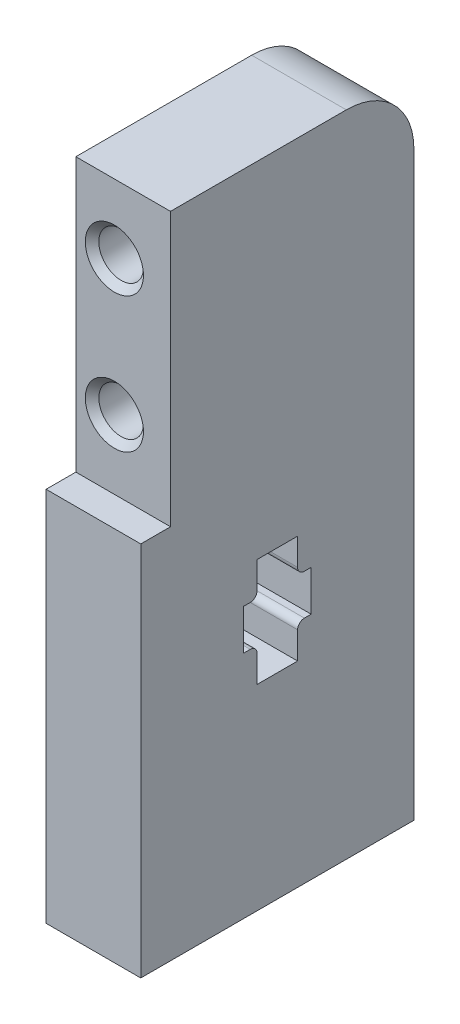
ISO-10303-21;
HEADER;
FILE_DESCRIPTION(('STEP AP214'),'2;1');
FILE_NAME('part.step','',(''),(''),'','','');
FILE_SCHEMA(('AUTOMOTIVE_DESIGN { 1 0 10303 214 1 1 1 1 }'));
ENDSEC;
DATA;
#1=APPLICATION_CONTEXT('core data for automotive mechanical design processes');
#2=APPLICATION_PROTOCOL_DEFINITION('international standard','automotive_design',2000,#1);
#3=PRODUCT_CONTEXT('',#1,'mechanical');
#4=PRODUCT('Part','Part','',(#3));
#5=PRODUCT_RELATED_PRODUCT_CATEGORY('part','',(#4));
#6=PRODUCT_DEFINITION_FORMATION('','',#4);
#7=PRODUCT_DEFINITION_CONTEXT('part definition',#1,'design');
#8=PRODUCT_DEFINITION('design','',#6,#7);
#9=PRODUCT_DEFINITION_SHAPE('','',#8);
#10=(LENGTH_UNIT() NAMED_UNIT(*) SI_UNIT(.MILLI.,.METRE.));
#11=(NAMED_UNIT(*) PLANE_ANGLE_UNIT() SI_UNIT($,.RADIAN.));
#12=(NAMED_UNIT(*) SI_UNIT($,.STERADIAN.) SOLID_ANGLE_UNIT());
#13=UNCERTAINTY_MEASURE_WITH_UNIT(LENGTH_MEASURE(1.E-05),#10,'distance_accuracy_value','');
#14=(GEOMETRIC_REPRESENTATION_CONTEXT(3) GLOBAL_UNCERTAINTY_ASSIGNED_CONTEXT((#13)) GLOBAL_UNIT_ASSIGNED_CONTEXT((#10,
#11,#12)) REPRESENTATION_CONTEXT('',''));
#15=CARTESIAN_POINT('',(0.,0.,0.));
#16=DIRECTION('',(0.,0.,1.));
#17=DIRECTION('',(1.,0.,0.));
#18=AXIS2_PLACEMENT_3D('',#15,#16,#17);
#19=CARTESIAN_POINT('',(0.,17.,-12.6));
#20=DIRECTION('',(0.,-1.,0.));
#21=DIRECTION('',(0.,0.,-1.));
#22=AXIS2_PLACEMENT_3D('',#19,#20,#21);
#23=PLANE('',#22);
#24=DIRECTION('',(0.,0.,-1.));
#25=VECTOR('',#24,1.);
#26=CARTESIAN_POINT('',(7.,17.,-12.6));
#27=LINE('',#26,#25);
#28=CARTESIAN_POINT('',(7.,17.,-7.6));
#29=VERTEX_POINT('',#28);
#30=CARTESIAN_POINT('',(7.,17.,-8.1));
#31=VERTEX_POINT('',#30);
#32=EDGE_CURVE('E250',#29,#31,#27,.T.);
#33=ORIENTED_EDGE('',*,*,#32,.T.);
#34=DIRECTION('',(1.,0.,0.));
#35=VECTOR('',#34,1.);
#36=CARTESIAN_POINT('',(0.,17.,-8.1));
#37=LINE('',#36,#35);
#38=CARTESIAN_POINT('',(0.,17.,-8.1));
#39=VERTEX_POINT('',#38);
#40=EDGE_CURVE('E48',#31,#39,#37,.F.);
#41=ORIENTED_EDGE('',*,*,#40,.T.);
#42=DIRECTION('',(0.,0.,-1.));
#43=VECTOR('',#42,1.);
#44=CARTESIAN_POINT('',(0.,17.,-12.6));
#45=LINE('',#44,#43);
#46=CARTESIAN_POINT('',(0.,17.,-7.6));
#47=VERTEX_POINT('',#46);
#48=EDGE_CURVE('E257',#47,#39,#45,.T.);
#49=ORIENTED_EDGE('',*,*,#48,.F.);
#50=DIRECTION('',(1.,0.,0.));
#51=VECTOR('',#50,1.);
#52=CARTESIAN_POINT('',(0.,17.,-7.6));
#53=LINE('',#52,#51);
#54=EDGE_CURVE('E274',#47,#29,#53,.T.);
#55=ORIENTED_EDGE('',*,*,#54,.T.);
#56=EDGE_LOOP('',(#33,#41,#49,#55));
#57=FACE_BOUND('',#56,.T.);
#58=ADVANCED_FACE('F33',(#57),#23,.F.);
#59=CARTESIAN_POINT('',(0.,20.,-7.6));
#60=DIRECTION('',(0.,1.,0.));
#61=DIRECTION('',(0.,0.,1.));
#62=AXIS2_PLACEMENT_3D('',#59,#60,#61);
#63=PLANE('',#62);
#64=DIRECTION('',(0.,0.,1.));
#65=VECTOR('',#64,1.);
#66=CARTESIAN_POINT('',(0.,20.,-7.6));
#67=LINE('',#66,#65);
#68=CARTESIAN_POINT('',(0.,20.,-8.1));
#69=VERTEX_POINT('',#68);
#70=CARTESIAN_POINT('',(0.,20.,-7.6));
#71=VERTEX_POINT('',#70);
#72=EDGE_CURVE('E249',#69,#71,#67,.T.);
#73=ORIENTED_EDGE('',*,*,#72,.F.);
#74=DIRECTION('',(1.,0.,0.));
#75=VECTOR('',#74,1.);
#76=CARTESIAN_POINT('',(0.,20.,-8.1));
#77=LINE('',#76,#75);
#78=CARTESIAN_POINT('',(7.,20.,-8.1));
#79=VERTEX_POINT('',#78);
#80=EDGE_CURVE('E368',#69,#79,#77,.T.);
#81=ORIENTED_EDGE('',*,*,#80,.T.);
#82=DIRECTION('',(0.,0.,1.));
#83=VECTOR('',#82,1.);
#84=CARTESIAN_POINT('',(7.,20.,-7.6));
#85=LINE('',#84,#83);
#86=CARTESIAN_POINT('',(7.,20.,-7.6));
#87=VERTEX_POINT('',#86);
#88=EDGE_CURVE('E261',#79,#87,#85,.T.);
#89=ORIENTED_EDGE('',*,*,#88,.T.);
#90=DIRECTION('',(1.,0.,0.));
#91=VECTOR('',#90,1.);
#92=CARTESIAN_POINT('',(0.,20.,-7.6));
#93=LINE('',#92,#91);
#94=EDGE_CURVE('E276',#71,#87,#93,.T.);
#95=ORIENTED_EDGE('',*,*,#94,.F.);
#96=EDGE_LOOP('',(#73,#81,#89,#95));
#97=FACE_BOUND('',#96,.T.);
#98=ADVANCED_FACE('F421',(#97),#63,.F.);
#99=CARTESIAN_POINT('',(7.,0.,0.));
#100=DIRECTION('',(0.,1.,0.));
#101=DIRECTION('',(0.,0.,1.));
#102=AXIS2_PLACEMENT_3D('',#99,#100,#101);
#103=PLANE('',#102);
#104=CARTESIAN_POINT('',(2.85000000000001,0.,-15.1));
#105=DIRECTION('',(0.,1.,0.));
#106=DIRECTION('',(0.,0.,1.));
#107=AXIS2_PLACEMENT_3D('',#104,#105,#106);
#108=CIRCLE('',#107,2.14999999999998);
#109=CARTESIAN_POINT('',(2.85000000000001,0.,-12.95));
#110=VERTEX_POINT('',#109);
#111=EDGE_CURVE('E338',#110,#110,#108,.T.);
#112=ORIENTED_EDGE('',*,*,#111,.T.);
#113=EDGE_LOOP('',(#112));
#114=FACE_BOUND('',#113,.T.);
#115=CARTESIAN_POINT('',(2.85,0.,-5.1));
#116=DIRECTION('',(0.,1.,0.));
#117=DIRECTION('',(0.,0.,1.));
#118=AXIS2_PLACEMENT_3D('',#115,#116,#117);
#119=CIRCLE('',#118,2.12);
#120=CARTESIAN_POINT('',(2.85,0.,-2.97999999999999));
#121=VERTEX_POINT('',#120);
#122=EDGE_CURVE('E335',#121,#121,#119,.T.);
#123=ORIENTED_EDGE('',*,*,#122,.T.);
#124=EDGE_LOOP('',(#123));
#125=FACE_BOUND('',#124,.T.);
#126=DIRECTION('',(0.,0.,-1.));
#127=VECTOR('',#126,1.);
#128=CARTESIAN_POINT('',(0.,0.,0.));
#129=LINE('',#128,#127);
#130=CARTESIAN_POINT('',(0.,0.,0.));
#131=VERTEX_POINT('',#130);
#132=CARTESIAN_POINT('',(0.,0.,-20.2));
#133=VERTEX_POINT('',#132);
#134=EDGE_CURVE('E324',#131,#133,#129,.T.);
#135=ORIENTED_EDGE('',*,*,#134,.T.);
#136=DIRECTION('',(-1.,0.,0.));
#137=VECTOR('',#136,1.);
#138=CARTESIAN_POINT('',(7.,0.,-20.2));
#139=LINE('',#138,#137);
#140=CARTESIAN_POINT('',(7.,0.,-20.2));
#141=VERTEX_POINT('',#140);
#142=EDGE_CURVE('E322',#141,#133,#139,.T.);
#143=ORIENTED_EDGE('',*,*,#142,.F.);
#144=DIRECTION('',(0.,0.,-1.));
#145=VECTOR('',#144,1.);
#146=CARTESIAN_POINT('',(7.,0.,0.));
#147=LINE('',#146,#145);
#148=CARTESIAN_POINT('',(7.,0.,0.));
#149=VERTEX_POINT('',#148);
#150=EDGE_CURVE('E314',#149,#141,#147,.T.);
#151=ORIENTED_EDGE('',*,*,#150,.F.);
#152=DIRECTION('',(-1.,0.,0.));
#153=VECTOR('',#152,1.);
#154=CARTESIAN_POINT('',(7.,0.,0.));
#155=LINE('',#154,#153);
#156=EDGE_CURVE('E332',#149,#131,#155,.T.);
#157=ORIENTED_EDGE('',*,*,#156,.T.);
#158=EDGE_LOOP('',(#135,#143,#151,#157));
#159=FACE_BOUND('',#158,.T.);
#160=ADVANCED_FACE('F462',(#114,#125,#159),#103,.F.);
#161=CARTESIAN_POINT('',(7.,48.,0.));
#162=DIRECTION('',(0.,-1.,0.));
#163=DIRECTION('',(0.,0.,-1.));
#164=AXIS2_PLACEMENT_3D('',#161,#162,#163);
#165=PLANE('',#164);
#166=DIRECTION('',(0.,0.,1.));
#167=VECTOR('',#166,1.);
#168=CARTESIAN_POINT('',(7.,48.,0.));
#169=LINE('',#168,#167);
#170=CARTESIAN_POINT('',(7.,48.,-15.2));
#171=VERTEX_POINT('',#170);
#172=CARTESIAN_POINT('',(7.,48.,-2.2));
#173=VERTEX_POINT('',#172);
#174=EDGE_CURVE('E320',#171,#173,#169,.T.);
#175=ORIENTED_EDGE('',*,*,#174,.F.);
#176=DIRECTION('',(-1.,0.,0.));
#177=VECTOR('',#176,1.);
#178=CARTESIAN_POINT('',(7.,48.,-15.2));
#179=LINE('',#178,#177);
#180=CARTESIAN_POINT('',(0.,48.,-15.2));
#181=VERTEX_POINT('',#180);
#182=EDGE_CURVE('E359',#171,#181,#179,.T.);
#183=ORIENTED_EDGE('',*,*,#182,.T.);
#184=DIRECTION('',(0.,0.,1.));
#185=VECTOR('',#184,1.);
#186=CARTESIAN_POINT('',(0.,48.,0.));
#187=LINE('',#186,#185);
#188=CARTESIAN_POINT('',(0.,48.,-2.2));
#189=VERTEX_POINT('',#188);
#190=EDGE_CURVE('E315',#181,#189,#187,.T.);
#191=ORIENTED_EDGE('',*,*,#190,.T.);
#192=DIRECTION('',(-1.,0.,0.));
#193=VECTOR('',#192,1.);
#194=CARTESIAN_POINT('',(0.,48.,-2.2));
#195=LINE('',#194,#193);
#196=EDGE_CURVE('E302',#173,#189,#195,.T.);
#197=ORIENTED_EDGE('',*,*,#196,.F.);
#198=EDGE_LOOP('',(#175,#183,#191,#197));
#199=FACE_BOUND('',#198,.T.);
#200=ADVANCED_FACE('F525',(#199),#165,.F.);
#201=CARTESIAN_POINT('',(7.,0.,0.));
#202=DIRECTION('',(0.,0.,-1.));
#203=DIRECTION('',(-1.,0.,0.));
#204=AXIS2_PLACEMENT_3D('',#201,#202,#203);
#205=PLANE('',#204);
#206=DIRECTION('',(0.,-1.,0.));
#207=VECTOR('',#206,1.);
#208=CARTESIAN_POINT('',(7.,0.,0.));
#209=LINE('',#208,#207);
#210=CARTESIAN_POINT('',(7.,27.8,0.));
#211=VERTEX_POINT('',#210);
#212=EDGE_CURVE('E312',#211,#149,#209,.T.);
#213=ORIENTED_EDGE('',*,*,#212,.F.);
#214=DIRECTION('',(1.,0.,0.));
#215=VECTOR('',#214,1.);
#216=CARTESIAN_POINT('',(0.,27.8,0.));
#217=LINE('',#216,#215);
#218=CARTESIAN_POINT('',(0.,27.8,0.));
#219=VERTEX_POINT('',#218);
#220=EDGE_CURVE('E292',#219,#211,#217,.T.);
#221=ORIENTED_EDGE('',*,*,#220,.F.);
#222=DIRECTION('',(0.,-1.,0.));
#223=VECTOR('',#222,1.);
#224=CARTESIAN_POINT('',(0.,0.,0.));
#225=LINE('',#224,#223);
#226=EDGE_CURVE('E310',#219,#131,#225,.T.);
#227=ORIENTED_EDGE('',*,*,#226,.T.);
#228=ORIENTED_EDGE('',*,*,#156,.F.);
#229=EDGE_LOOP('',(#213,#221,#227,#228));
#230=FACE_BOUND('',#229,.T.);
#231=ADVANCED_FACE('F528',(#230),#205,.F.);
#232=CARTESIAN_POINT('',(7.,0.,-20.2));
#233=DIRECTION('',(0.,0.,1.));
#234=DIRECTION('',(1.,0.,0.));
#235=AXIS2_PLACEMENT_3D('',#232,#233,#234);
#236=PLANE('',#235);
#237=DIRECTION('',(0.,1.,0.));
#238=VECTOR('',#237,1.);
#239=CARTESIAN_POINT('',(0.,0.,-20.2));
#240=LINE('',#239,#238);
#241=CARTESIAN_POINT('',(0.,43.,-20.2));
#242=VERTEX_POINT('',#241);
#243=EDGE_CURVE('E326',#133,#242,#240,.T.);
#244=ORIENTED_EDGE('',*,*,#243,.T.);
#245=DIRECTION('',(-1.,0.,0.));
#246=VECTOR('',#245,1.);
#247=CARTESIAN_POINT('',(7.,43.,-20.2));
#248=LINE('',#247,#246);
#249=CARTESIAN_POINT('',(7.,43.,-20.2));
#250=VERTEX_POINT('',#249);
#251=EDGE_CURVE('E364',#242,#250,#248,.F.);
#252=ORIENTED_EDGE('',*,*,#251,.T.);
#253=DIRECTION('',(0.,1.,0.));
#254=VECTOR('',#253,1.);
#255=CARTESIAN_POINT('',(7.,0.,-20.2));
#256=LINE('',#255,#254);
#257=EDGE_CURVE('E317',#141,#250,#256,.T.);
#258=ORIENTED_EDGE('',*,*,#257,.F.);
#259=ORIENTED_EDGE('',*,*,#142,.T.);
#260=EDGE_LOOP('',(#244,#252,#258,#259));
#261=FACE_BOUND('',#260,.T.);
#262=ADVANCED_FACE('F522',(#261),#236,.F.);
#263=CARTESIAN_POINT('',(7.,0.,0.));
#264=DIRECTION('',(-1.,0.,0.));
#265=DIRECTION('',(0.,0.,1.));
#266=AXIS2_PLACEMENT_3D('',#263,#264,#265);
#267=PLANE('',#266);
#268=ORIENTED_EDGE('',*,*,#88,.F.);
#269=CARTESIAN_POINT('',(7.,20.5,-8.1));
#270=DIRECTION('',(-1.,0.,0.));
#271=DIRECTION('',(0.,0.,1.));
#272=AXIS2_PLACEMENT_3D('',#269,#270,#271);
#273=CIRCLE('',#272,0.5);
#274=CARTESIAN_POINT('',(7.,20.5,-8.6));
#275=VERTEX_POINT('',#274);
#276=EDGE_CURVE('E377',#79,#275,#273,.F.);
#277=ORIENTED_EDGE('',*,*,#276,.T.);
#278=DIRECTION('',(0.,-1.,0.));
#279=VECTOR('',#278,1.);
#280=CARTESIAN_POINT('',(7.,22.5,-8.6));
#281=LINE('',#280,#279);
#282=CARTESIAN_POINT('',(7.,22.5,-8.6));
#283=VERTEX_POINT('',#282);
#284=EDGE_CURVE('E224',#283,#275,#281,.T.);
#285=ORIENTED_EDGE('',*,*,#284,.F.);
#286=DIRECTION('',(0.,0.,1.));
#287=VECTOR('',#286,1.);
#288=CARTESIAN_POINT('',(7.,22.5,-8.6));
#289=LINE('',#288,#287);
#290=CARTESIAN_POINT('',(7.,22.5,-11.6));
#291=VERTEX_POINT('',#290);
#292=EDGE_CURVE('E229',#291,#283,#289,.T.);
#293=ORIENTED_EDGE('',*,*,#292,.F.);
#294=DIRECTION('',(0.,1.,0.));
#295=VECTOR('',#294,1.);
#296=CARTESIAN_POINT('',(7.,22.5,-11.6));
#297=LINE('',#296,#295);
#298=CARTESIAN_POINT('',(7.,20.5,-11.6));
#299=VERTEX_POINT('',#298);
#300=EDGE_CURVE('E237',#299,#291,#297,.T.);
#301=ORIENTED_EDGE('',*,*,#300,.F.);
#302=CARTESIAN_POINT('',(7.,20.5,-12.1));
#303=DIRECTION('',(-1.,0.,0.));
#304=DIRECTION('',(0.,0.,1.));
#305=AXIS2_PLACEMENT_3D('',#302,#303,#304);
#306=CIRCLE('',#305,0.5);
#307=CARTESIAN_POINT('',(7.,20.,-12.1));
#308=VERTEX_POINT('',#307);
#309=EDGE_CURVE('E371',#299,#308,#306,.F.);
#310=ORIENTED_EDGE('',*,*,#309,.T.);
#311=CARTESIAN_POINT('',(7.,20.,-12.6));
#312=VERTEX_POINT('',#311);
#313=EDGE_CURVE('E262',#312,#308,#85,.T.);
#314=ORIENTED_EDGE('',*,*,#313,.F.);
#315=DIRECTION('',(0.,1.,0.));
#316=VECTOR('',#315,1.);
#317=CARTESIAN_POINT('',(7.,20.,-12.6));
#318=LINE('',#317,#316);
#319=CARTESIAN_POINT('',(7.,17.,-12.6));
#320=VERTEX_POINT('',#319);
#321=EDGE_CURVE('E243',#320,#312,#318,.T.);
#322=ORIENTED_EDGE('',*,*,#321,.F.);
#323=CARTESIAN_POINT('',(7.,17.,-12.1));
#324=VERTEX_POINT('',#323);
#325=EDGE_CURVE('E268',#324,#320,#27,.T.);
#326=ORIENTED_EDGE('',*,*,#325,.F.);
#327=CARTESIAN_POINT('',(7.,16.5,-12.1));
#328=DIRECTION('',(-1.,0.,0.));
#329=DIRECTION('',(0.,0.,1.));
#330=AXIS2_PLACEMENT_3D('',#327,#328,#329);
#331=CIRCLE('',#330,0.5);
#332=CARTESIAN_POINT('',(7.,16.5,-11.6));
#333=VERTEX_POINT('',#332);
#334=EDGE_CURVE('E373',#324,#333,#331,.F.);
#335=ORIENTED_EDGE('',*,*,#334,.T.);
#336=DIRECTION('',(0.,1.,0.));
#337=VECTOR('',#336,1.);
#338=CARTESIAN_POINT('',(7.,14.5,-11.6));
#339=LINE('',#338,#337);
#340=CARTESIAN_POINT('',(7.,14.5,-11.6));
#341=VERTEX_POINT('',#340);
#342=EDGE_CURVE('E218',#341,#333,#339,.T.);
#343=ORIENTED_EDGE('',*,*,#342,.F.);
#344=DIRECTION('',(0.,0.,-1.));
#345=VECTOR('',#344,1.);
#346=CARTESIAN_POINT('',(7.,14.5,-8.6));
#347=LINE('',#346,#345);
#348=CARTESIAN_POINT('',(7.,14.5,-8.6));
#349=VERTEX_POINT('',#348);
#350=EDGE_CURVE('E197',#349,#341,#347,.T.);
#351=ORIENTED_EDGE('',*,*,#350,.F.);
#352=DIRECTION('',(0.,-1.,0.));
#353=VECTOR('',#352,1.);
#354=CARTESIAN_POINT('',(7.,14.5,-8.6));
#355=LINE('',#354,#353);
#356=CARTESIAN_POINT('',(7.,16.5,-8.6));
#357=VERTEX_POINT('',#356);
#358=EDGE_CURVE('E216',#357,#349,#355,.T.);
#359=ORIENTED_EDGE('',*,*,#358,.F.);
#360=CARTESIAN_POINT('',(7.,16.5,-8.1));
#361=DIRECTION('',(-1.,0.,0.));
#362=DIRECTION('',(0.,0.,1.));
#363=AXIS2_PLACEMENT_3D('',#360,#361,#362);
#364=CIRCLE('',#363,0.5);
#365=EDGE_CURVE('E375',#357,#31,#364,.F.);
#366=ORIENTED_EDGE('',*,*,#365,.T.);
#367=ORIENTED_EDGE('',*,*,#32,.F.);
#368=DIRECTION('',(0.,-1.,0.));
#369=VECTOR('',#368,1.);
#370=CARTESIAN_POINT('',(7.,20.,-7.6));
#371=LINE('',#370,#369);
#372=EDGE_CURVE('E265',#87,#29,#371,.T.);
#373=ORIENTED_EDGE('',*,*,#372,.F.);
#374=EDGE_LOOP('',(#268,#277,#285,#293,#301,#310,#314,#322,#326,#335,#343,#351,#359,#366,#367,#373));
#375=FACE_BOUND('',#374,.T.);
#376=ORIENTED_EDGE('',*,*,#257,.T.);
#377=CARTESIAN_POINT('',(7.,43.,-15.2));
#378=DIRECTION('',(-1.,0.,0.));
#379=DIRECTION('',(0.,0.,1.));
#380=AXIS2_PLACEMENT_3D('',#377,#378,#379);
#381=CIRCLE('',#380,5.);
#382=EDGE_CURVE('E366',#250,#171,#381,.F.);
#383=ORIENTED_EDGE('',*,*,#382,.T.);
#384=ORIENTED_EDGE('',*,*,#174,.T.);
#385=DIRECTION('',(0.,1.,0.));
#386=VECTOR('',#385,1.);
#387=CARTESIAN_POINT('',(7.,48.,-2.2));
#388=LINE('',#387,#386);
#389=CARTESIAN_POINT('',(7.,27.8,-2.2));
#390=VERTEX_POINT('',#389);
#391=EDGE_CURVE('E299',#390,#173,#388,.T.);
#392=ORIENTED_EDGE('',*,*,#391,.F.);
#393=DIRECTION('',(0.,0.,1.));
#394=VECTOR('',#393,1.);
#395=CARTESIAN_POINT('',(7.,27.8,-2.2));
#396=LINE('',#395,#394);
#397=EDGE_CURVE('E307',#390,#211,#396,.T.);
#398=ORIENTED_EDGE('',*,*,#397,.T.);
#399=ORIENTED_EDGE('',*,*,#212,.T.);
#400=ORIENTED_EDGE('',*,*,#150,.T.);
#401=EDGE_LOOP('',(#376,#383,#384,#392,#398,#399,#400));
#402=FACE_BOUND('',#401,.T.);
#403=ADVANCED_FACE('F405',(#375,#402),#267,.F.);
#404=CARTESIAN_POINT('',(0.,0.,0.));
#405=DIRECTION('',(-1.,0.,0.));
#406=DIRECTION('',(0.,0.,1.));
#407=AXIS2_PLACEMENT_3D('',#404,#405,#406);
#408=PLANE('',#407);
#409=DIRECTION('',(0.,-1.,0.));
#410=VECTOR('',#409,1.);
#411=CARTESIAN_POINT('',(0.,22.5,-8.6));
#412=LINE('',#411,#410);
#413=CARTESIAN_POINT('',(0.,22.5,-8.6));
#414=VERTEX_POINT('',#413);
#415=CARTESIAN_POINT('',(0.,20.5,-8.6));
#416=VERTEX_POINT('',#415);
#417=EDGE_CURVE('E226',#414,#416,#412,.T.);
#418=ORIENTED_EDGE('',*,*,#417,.T.);
#419=CARTESIAN_POINT('',(0.,20.5,-8.1));
#420=DIRECTION('',(-1.,0.,0.));
#421=DIRECTION('',(0.,0.,1.));
#422=AXIS2_PLACEMENT_3D('',#419,#420,#421);
#423=CIRCLE('',#422,0.5);
#424=EDGE_CURVE('E386',#416,#69,#423,.T.);
#425=ORIENTED_EDGE('',*,*,#424,.T.);
#426=ORIENTED_EDGE('',*,*,#72,.T.);
#427=DIRECTION('',(0.,-1.,0.));
#428=VECTOR('',#427,1.);
#429=CARTESIAN_POINT('',(0.,20.,-7.6));
#430=LINE('',#429,#428);
#431=EDGE_CURVE('E253',#71,#47,#430,.T.);
#432=ORIENTED_EDGE('',*,*,#431,.T.);
#433=ORIENTED_EDGE('',*,*,#48,.T.);
#434=CARTESIAN_POINT('',(0.,16.5,-8.1));
#435=DIRECTION('',(-1.,0.,0.));
#436=DIRECTION('',(0.,0.,1.));
#437=AXIS2_PLACEMENT_3D('',#434,#435,#436);
#438=CIRCLE('',#437,0.5);
#439=CARTESIAN_POINT('',(0.,16.5,-8.6));
#440=VERTEX_POINT('',#439);
#441=EDGE_CURVE('E384',#39,#440,#438,.T.);
#442=ORIENTED_EDGE('',*,*,#441,.T.);
#443=DIRECTION('',(0.,-1.,0.));
#444=VECTOR('',#443,1.);
#445=CARTESIAN_POINT('',(0.,14.5,-8.6));
#446=LINE('',#445,#444);
#447=CARTESIAN_POINT('',(0.,14.5,-8.6));
#448=VERTEX_POINT('',#447);
#449=EDGE_CURVE('E202',#440,#448,#446,.T.);
#450=ORIENTED_EDGE('',*,*,#449,.T.);
#451=DIRECTION('',(0.,0.,-1.));
#452=VECTOR('',#451,1.);
#453=CARTESIAN_POINT('',(0.,14.5,-8.6));
#454=LINE('',#453,#452);
#455=CARTESIAN_POINT('',(0.,14.5,-11.6));
#456=VERTEX_POINT('',#455);
#457=EDGE_CURVE('E195',#448,#456,#454,.T.);
#458=ORIENTED_EDGE('',*,*,#457,.T.);
#459=DIRECTION('',(0.,1.,0.));
#460=VECTOR('',#459,1.);
#461=CARTESIAN_POINT('',(0.,14.5,-11.6));
#462=LINE('',#461,#460);
#463=CARTESIAN_POINT('',(0.,16.5,-11.6));
#464=VERTEX_POINT('',#463);
#465=EDGE_CURVE('E205',#456,#464,#462,.T.);
#466=ORIENTED_EDGE('',*,*,#465,.T.);
#467=CARTESIAN_POINT('',(0.,16.5,-12.1));
#468=DIRECTION('',(-1.,0.,0.));
#469=DIRECTION('',(0.,0.,1.));
#470=AXIS2_PLACEMENT_3D('',#467,#468,#469);
#471=CIRCLE('',#470,0.5);
#472=CARTESIAN_POINT('',(0.,17.,-12.1));
#473=VERTEX_POINT('',#472);
#474=EDGE_CURVE('E382',#464,#473,#471,.T.);
#475=ORIENTED_EDGE('',*,*,#474,.T.);
#476=CARTESIAN_POINT('',(0.,17.,-12.6));
#477=VERTEX_POINT('',#476);
#478=EDGE_CURVE('E256',#473,#477,#45,.T.);
#479=ORIENTED_EDGE('',*,*,#478,.T.);
#480=DIRECTION('',(0.,1.,0.));
#481=VECTOR('',#480,1.);
#482=CARTESIAN_POINT('',(0.,20.,-12.6));
#483=LINE('',#482,#481);
#484=CARTESIAN_POINT('',(0.,20.,-12.6));
#485=VERTEX_POINT('',#484);
#486=EDGE_CURVE('E246',#477,#485,#483,.T.);
#487=ORIENTED_EDGE('',*,*,#486,.T.);
#488=CARTESIAN_POINT('',(0.,20.,-12.1));
#489=VERTEX_POINT('',#488);
#490=EDGE_CURVE('E251',#485,#489,#67,.T.);
#491=ORIENTED_EDGE('',*,*,#490,.T.);
#492=CARTESIAN_POINT('',(0.,20.5,-12.1));
#493=DIRECTION('',(-1.,0.,0.));
#494=DIRECTION('',(0.,0.,1.));
#495=AXIS2_PLACEMENT_3D('',#492,#493,#494);
#496=CIRCLE('',#495,0.5);
#497=CARTESIAN_POINT('',(0.,20.5,-11.6));
#498=VERTEX_POINT('',#497);
#499=EDGE_CURVE('E56',#489,#498,#496,.T.);
#500=ORIENTED_EDGE('',*,*,#499,.T.);
#501=DIRECTION('',(0.,1.,0.));
#502=VECTOR('',#501,1.);
#503=CARTESIAN_POINT('',(0.,22.5,-11.6));
#504=LINE('',#503,#502);
#505=CARTESIAN_POINT('',(0.,22.5,-11.6));
#506=VERTEX_POINT('',#505);
#507=EDGE_CURVE('E228',#498,#506,#504,.T.);
#508=ORIENTED_EDGE('',*,*,#507,.T.);
#509=DIRECTION('',(0.,0.,1.));
#510=VECTOR('',#509,1.);
#511=CARTESIAN_POINT('',(0.,22.5,-8.6));
#512=LINE('',#511,#510);
#513=EDGE_CURVE('E231',#506,#414,#512,.T.);
#514=ORIENTED_EDGE('',*,*,#513,.T.);
#515=EDGE_LOOP('',(#418,#425,#426,#432,#433,#442,#450,#458,#466,#475,#479,#487,#491,#500,#508,#514));
#516=FACE_BOUND('',#515,.T.);
#517=ORIENTED_EDGE('',*,*,#190,.F.);
#518=CARTESIAN_POINT('',(0.,43.,-15.2));
#519=DIRECTION('',(-1.,0.,0.));
#520=DIRECTION('',(0.,0.,1.));
#521=AXIS2_PLACEMENT_3D('',#518,#519,#520);
#522=CIRCLE('',#521,5.);
#523=EDGE_CURVE('E362',#181,#242,#522,.T.);
#524=ORIENTED_EDGE('',*,*,#523,.T.);
#525=ORIENTED_EDGE('',*,*,#243,.F.);
#526=ORIENTED_EDGE('',*,*,#134,.F.);
#527=ORIENTED_EDGE('',*,*,#226,.F.);
#528=DIRECTION('',(0.,0.,1.));
#529=VECTOR('',#528,1.);
#530=CARTESIAN_POINT('',(0.,27.8,-2.2));
#531=LINE('',#530,#529);
#532=CARTESIAN_POINT('',(0.,27.8,-2.2));
#533=VERTEX_POINT('',#532);
#534=EDGE_CURVE('E305',#533,#219,#531,.T.);
#535=ORIENTED_EDGE('',*,*,#534,.F.);
#536=DIRECTION('',(0.,-1.,0.));
#537=VECTOR('',#536,1.);
#538=CARTESIAN_POINT('',(0.,48.,-2.2));
#539=LINE('',#538,#537);
#540=EDGE_CURVE('E293',#189,#533,#539,.T.);
#541=ORIENTED_EDGE('',*,*,#540,.F.);
#542=EDGE_LOOP('',(#517,#524,#525,#526,#527,#535,#541));
#543=FACE_BOUND('',#542,.T.);
#544=ADVANCED_FACE('F212',(#516,#543),#408,.T.);
#545=CARTESIAN_POINT('',(0.,27.8,-2.2));
#546=DIRECTION('',(0.,-1.,0.));
#547=DIRECTION('',(0.,0.,-1.));
#548=AXIS2_PLACEMENT_3D('',#545,#546,#547);
#549=PLANE('',#548);
#550=ORIENTED_EDGE('',*,*,#220,.T.);
#551=ORIENTED_EDGE('',*,*,#397,.F.);
#552=DIRECTION('',(1.,0.,0.));
#553=VECTOR('',#552,1.);
#554=CARTESIAN_POINT('',(0.,27.8,-2.2));
#555=LINE('',#554,#553);
#556=EDGE_CURVE('E296',#533,#390,#555,.T.);
#557=ORIENTED_EDGE('',*,*,#556,.F.);
#558=ORIENTED_EDGE('',*,*,#534,.T.);
#559=EDGE_LOOP('',(#550,#551,#557,#558));
#560=FACE_BOUND('',#559,.T.);
#561=ADVANCED_FACE('F515',(#560),#549,.F.);
#562=CARTESIAN_POINT('',(0.,0.,-2.2));
#563=DIRECTION('',(0.,0.,1.));
#564=DIRECTION('',(1.,0.,0.));
#565=AXIS2_PLACEMENT_3D('',#562,#563,#564);
#566=PLANE('',#565);
#567=CARTESIAN_POINT('',(2.85,32.9,-2.2));
#568=DIRECTION('',(0.,0.,1.));
#569=DIRECTION('',(1.,0.,0.));
#570=AXIS2_PLACEMENT_3D('',#567,#568,#569);
#571=CIRCLE('',#570,2.15);
#572=CARTESIAN_POINT('',(5.,32.9,-2.2));
#573=VERTEX_POINT('',#572);
#574=EDGE_CURVE('E353',#573,#573,#571,.F.);
#575=ORIENTED_EDGE('',*,*,#574,.T.);
#576=EDGE_LOOP('',(#575));
#577=FACE_BOUND('',#576,.T.);
#578=CARTESIAN_POINT('',(2.85,42.9,-2.2));
#579=DIRECTION('',(0.,0.,1.));
#580=DIRECTION('',(1.,0.,0.));
#581=AXIS2_PLACEMENT_3D('',#578,#579,#580);
#582=CIRCLE('',#581,2.15);
#583=CARTESIAN_POINT('',(5.,42.9,-2.2));
#584=VERTEX_POINT('',#583);
#585=EDGE_CURVE('E350',#584,#584,#582,.F.);
#586=ORIENTED_EDGE('',*,*,#585,.T.);
#587=EDGE_LOOP('',(#586));
#588=FACE_BOUND('',#587,.T.);
#589=ORIENTED_EDGE('',*,*,#540,.T.);
#590=ORIENTED_EDGE('',*,*,#556,.T.);
#591=ORIENTED_EDGE('',*,*,#391,.T.);
#592=ORIENTED_EDGE('',*,*,#196,.T.);
#593=EDGE_LOOP('',(#589,#590,#591,#592));
#594=FACE_BOUND('',#593,.T.);
#595=ADVANCED_FACE('F511',(#577,#588,#594),#566,.T.);
#596=CARTESIAN_POINT('',(2.85,15.,-5.1));
#597=DIRECTION('',(0.,-1.,0.));
#598=DIRECTION('',(0.,0.,-1.));
#599=AXIS2_PLACEMENT_3D('',#596,#597,#598);
#600=CYLINDRICAL_SURFACE('',#599,1.62);
#601=CARTESIAN_POINT('',(2.85,0.500000000000004,-5.1));
#602=DIRECTION('',(0.,1.,0.));
#603=DIRECTION('',(0.,0.,1.));
#604=AXIS2_PLACEMENT_3D('',#601,#602,#603);
#605=CIRCLE('',#604,1.62);
#606=CARTESIAN_POINT('',(2.85,0.500000000000004,-3.48));
#607=VERTEX_POINT('',#606);
#608=EDGE_CURVE('E344',#607,#607,#605,.F.);
#609=ORIENTED_EDGE('',*,*,#608,.T.);
#610=EDGE_LOOP('',(#609));
#611=FACE_BOUND('',#610,.T.);
#612=CARTESIAN_POINT('',(2.85,15.,-5.1));
#613=DIRECTION('',(0.,-1.,0.));
#614=DIRECTION('',(0.,0.,-1.));
#615=AXIS2_PLACEMENT_3D('',#612,#613,#614);
#616=CIRCLE('',#615,1.62);
#617=CARTESIAN_POINT('',(2.85,15.,-6.72));
#618=VERTEX_POINT('',#617);
#619=EDGE_CURVE('E289',#618,#618,#616,.F.);
#620=ORIENTED_EDGE('',*,*,#619,.T.);
#621=EDGE_LOOP('',(#620));
#622=FACE_BOUND('',#621,.T.);
#623=ADVANCED_FACE('F507',(#611,#622),#600,.F.);
#624=CARTESIAN_POINT('',(0.,15.,0.));
#625=DIRECTION('',(0.,-1.,0.));
#626=DIRECTION('',(0.,0.,-1.));
#627=AXIS2_PLACEMENT_3D('',#624,#625,#626);
#628=PLANE('',#627);
#629=ORIENTED_EDGE('',*,*,#619,.F.);
#630=EDGE_LOOP('',(#629));
#631=FACE_BOUND('',#630,.T.);
#632=ADVANCED_FACE('F503',(#631),#628,.T.);
#633=CARTESIAN_POINT('',(2.85000000000001,15.,-15.1));
#634=DIRECTION('',(0.,-1.,0.));
#635=DIRECTION('',(0.,0.,-1.));
#636=AXIS2_PLACEMENT_3D('',#633,#634,#635);
#637=CYLINDRICAL_SURFACE('',#636,1.65);
#638=CARTESIAN_POINT('',(2.85000000000001,0.499999999999992,-15.1));
#639=DIRECTION('',(0.,1.,0.));
#640=DIRECTION('',(0.,0.,1.));
#641=AXIS2_PLACEMENT_3D('',#638,#639,#640);
#642=CIRCLE('',#641,1.65);
#643=CARTESIAN_POINT('',(2.85000000000001,0.499999999999992,-13.45));
#644=VERTEX_POINT('',#643);
#645=EDGE_CURVE('E341',#644,#644,#642,.F.);
#646=ORIENTED_EDGE('',*,*,#645,.T.);
#647=EDGE_LOOP('',(#646));
#648=FACE_BOUND('',#647,.T.);
#649=CARTESIAN_POINT('',(2.85000000000001,15.,-15.1));
#650=DIRECTION('',(0.,-1.,0.));
#651=DIRECTION('',(0.,0.,-1.));
#652=AXIS2_PLACEMENT_3D('',#649,#650,#651);
#653=CIRCLE('',#652,1.65);
#654=CARTESIAN_POINT('',(2.85000000000001,15.,-16.75));
#655=VERTEX_POINT('',#654);
#656=EDGE_CURVE('E286',#655,#655,#653,.F.);
#657=ORIENTED_EDGE('',*,*,#656,.T.);
#658=EDGE_LOOP('',(#657));
#659=FACE_BOUND('',#658,.T.);
#660=ADVANCED_FACE('F499',(#648,#659),#637,.F.);
#661=CARTESIAN_POINT('',(0.,15.,0.));
#662=DIRECTION('',(0.,-1.,0.));
#663=DIRECTION('',(0.,0.,-1.));
#664=AXIS2_PLACEMENT_3D('',#661,#662,#663);
#665=PLANE('',#664);
#666=ORIENTED_EDGE('',*,*,#656,.F.);
#667=EDGE_LOOP('',(#666));
#668=FACE_BOUND('',#667,.T.);
#669=ADVANCED_FACE('F495',(#668),#665,.T.);
#670=CARTESIAN_POINT('',(2.85,42.9,-17.2));
#671=DIRECTION('',(0.,0.,1.));
#672=DIRECTION('',(1.,0.,0.));
#673=AXIS2_PLACEMENT_3D('',#670,#671,#672);
#674=CYLINDRICAL_SURFACE('',#673,1.65);
#675=CARTESIAN_POINT('',(2.85,42.9,-2.7));
#676=DIRECTION('',(0.,0.,1.));
#677=DIRECTION('',(1.,0.,0.));
#678=AXIS2_PLACEMENT_3D('',#675,#676,#677);
#679=CIRCLE('',#678,1.65);
#680=CARTESIAN_POINT('',(4.5,42.9,-2.7));
#681=VERTEX_POINT('',#680);
#682=EDGE_CURVE('E356',#681,#681,#679,.T.);
#683=ORIENTED_EDGE('',*,*,#682,.T.);
#684=EDGE_LOOP('',(#683));
#685=FACE_BOUND('',#684,.T.);
#686=CARTESIAN_POINT('',(2.85,42.9,-17.2));
#687=DIRECTION('',(0.,0.,1.));
#688=DIRECTION('',(1.,0.,0.));
#689=AXIS2_PLACEMENT_3D('',#686,#687,#688);
#690=CIRCLE('',#689,1.65);
#691=CARTESIAN_POINT('',(4.5,42.9,-17.2));
#692=VERTEX_POINT('',#691);
#693=EDGE_CURVE('E283',#692,#692,#690,.T.);
#694=ORIENTED_EDGE('',*,*,#693,.F.);
#695=EDGE_LOOP('',(#694));
#696=FACE_BOUND('',#695,.T.);
#697=ADVANCED_FACE('F491',(#685,#696),#674,.F.);
#698=CARTESIAN_POINT('',(0.,0.,-17.2));
#699=DIRECTION('',(0.,0.,1.));
#700=DIRECTION('',(1.,0.,0.));
#701=AXIS2_PLACEMENT_3D('',#698,#699,#700);
#702=PLANE('',#701);
#703=ORIENTED_EDGE('',*,*,#693,.T.);
#704=EDGE_LOOP('',(#703));
#705=FACE_BOUND('',#704,.T.);
#706=ADVANCED_FACE('F487',(#705),#702,.T.);
#707=CARTESIAN_POINT('',(2.85,32.9,-17.2));
#708=DIRECTION('',(0.,0.,1.));
#709=DIRECTION('',(1.,0.,0.));
#710=AXIS2_PLACEMENT_3D('',#707,#708,#709);
#711=CYLINDRICAL_SURFACE('',#710,1.65);
#712=CARTESIAN_POINT('',(2.85,32.9,-2.7));
#713=DIRECTION('',(0.,0.,1.));
#714=DIRECTION('',(1.,0.,0.));
#715=AXIS2_PLACEMENT_3D('',#712,#713,#714);
#716=CIRCLE('',#715,1.65);
#717=CARTESIAN_POINT('',(4.5,32.9,-2.7));
#718=VERTEX_POINT('',#717);
#719=EDGE_CURVE('E347',#718,#718,#716,.T.);
#720=ORIENTED_EDGE('',*,*,#719,.T.);
#721=EDGE_LOOP('',(#720));
#722=FACE_BOUND('',#721,.T.);
#723=CARTESIAN_POINT('',(2.85,32.9,-17.2));
#724=DIRECTION('',(0.,0.,1.));
#725=DIRECTION('',(1.,0.,0.));
#726=AXIS2_PLACEMENT_3D('',#723,#724,#725);
#727=CIRCLE('',#726,1.65);
#728=CARTESIAN_POINT('',(4.5,32.9,-17.2));
#729=VERTEX_POINT('',#728);
#730=EDGE_CURVE('E273',#729,#729,#727,.T.);
#731=ORIENTED_EDGE('',*,*,#730,.F.);
#732=EDGE_LOOP('',(#731));
#733=FACE_BOUND('',#732,.T.);
#734=ADVANCED_FACE('F483',(#722,#733),#711,.F.);
#735=CARTESIAN_POINT('',(0.,0.,-17.2));
#736=DIRECTION('',(0.,0.,1.));
#737=DIRECTION('',(1.,0.,0.));
#738=AXIS2_PLACEMENT_3D('',#735,#736,#737);
#739=PLANE('',#738);
#740=ORIENTED_EDGE('',*,*,#730,.T.);
#741=EDGE_LOOP('',(#740));
#742=FACE_BOUND('',#741,.T.);
#743=ADVANCED_FACE('F479',(#742),#739,.T.);
#744=CARTESIAN_POINT('',(2.85000000000001,0.,-15.1));
#745=DIRECTION('',(0.,-1.,0.));
#746=DIRECTION('',(0.,0.,-1.));
#747=AXIS2_PLACEMENT_3D('',#744,#745,#746);
#748=CONICAL_SURFACE('',#747,2.14999999999999,0.785398163397441);
#749=ORIENTED_EDGE('',*,*,#645,.F.);
#750=EDGE_LOOP('',(#749));
#751=FACE_BOUND('',#750,.T.);
#752=ORIENTED_EDGE('',*,*,#111,.F.);
#753=EDGE_LOOP('',(#752));
#754=FACE_BOUND('',#753,.T.);
#755=ADVANCED_FACE('F482',(#751,#754),#748,.F.);
#756=CARTESIAN_POINT('',(2.85,0.,-5.1));
#757=DIRECTION('',(0.,-1.,0.));
#758=DIRECTION('',(0.,0.,-1.));
#759=AXIS2_PLACEMENT_3D('',#756,#757,#758);
#760=CONICAL_SURFACE('',#759,2.12,0.785398163397448);
#761=ORIENTED_EDGE('',*,*,#608,.F.);
#762=EDGE_LOOP('',(#761));
#763=FACE_BOUND('',#762,.T.);
#764=ORIENTED_EDGE('',*,*,#122,.F.);
#765=EDGE_LOOP('',(#764));
#766=FACE_BOUND('',#765,.T.);
#767=ADVANCED_FACE('F541',(#763,#766),#760,.F.);
#768=CARTESIAN_POINT('',(2.85,32.9,-2.7));
#769=DIRECTION('',(0.,0.,1.));
#770=DIRECTION('',(1.,0.,0.));
#771=AXIS2_PLACEMENT_3D('',#768,#769,#770);
#772=CONICAL_SURFACE('',#771,1.65,0.785398163397444);
#773=ORIENTED_EDGE('',*,*,#574,.F.);
#774=EDGE_LOOP('',(#773));
#775=FACE_BOUND('',#774,.T.);
#776=ORIENTED_EDGE('',*,*,#719,.F.);
#777=EDGE_LOOP('',(#776));
#778=FACE_BOUND('',#777,.T.);
#779=ADVANCED_FACE('F545',(#775,#778),#772,.F.);
#780=CARTESIAN_POINT('',(2.85,42.9,-2.7));
#781=DIRECTION('',(0.,0.,1.));
#782=DIRECTION('',(1.,0.,0.));
#783=AXIS2_PLACEMENT_3D('',#780,#781,#782);
#784=CONICAL_SURFACE('',#783,1.65,0.785398163397444);
#785=ORIENTED_EDGE('',*,*,#585,.F.);
#786=EDGE_LOOP('',(#785));
#787=FACE_BOUND('',#786,.T.);
#788=ORIENTED_EDGE('',*,*,#682,.F.);
#789=EDGE_LOOP('',(#788));
#790=FACE_BOUND('',#789,.T.);
#791=ADVANCED_FACE('F475',(#787,#790),#784,.F.);
#792=CARTESIAN_POINT('',(7.,43.,-15.2));
#793=DIRECTION('',(-1.,0.,0.));
#794=DIRECTION('',(0.,0.,1.));
#795=AXIS2_PLACEMENT_3D('',#792,#793,#794);
#796=CYLINDRICAL_SURFACE('',#795,5.);
#797=ORIENTED_EDGE('',*,*,#382,.F.);
#798=ORIENTED_EDGE('',*,*,#251,.F.);
#799=ORIENTED_EDGE('',*,*,#523,.F.);
#800=ORIENTED_EDGE('',*,*,#182,.F.);
#801=EDGE_LOOP('',(#797,#798,#799,#800));
#802=FACE_BOUND('',#801,.T.);
#803=ADVANCED_FACE('F471',(#802),#796,.T.);
#804=CARTESIAN_POINT('',(0.,20.,-12.6));
#805=DIRECTION('',(0.,0.,-1.));
#806=DIRECTION('',(-1.,0.,0.));
#807=AXIS2_PLACEMENT_3D('',#804,#805,#806);
#808=PLANE('',#807);
#809=ORIENTED_EDGE('',*,*,#321,.T.);
#810=DIRECTION('',(1.,0.,0.));
#811=VECTOR('',#810,1.);
#812=CARTESIAN_POINT('',(0.,20.,-12.6));
#813=LINE('',#812,#811);
#814=EDGE_CURVE('E259',#485,#312,#813,.T.);
#815=ORIENTED_EDGE('',*,*,#814,.F.);
#816=ORIENTED_EDGE('',*,*,#486,.F.);
#817=DIRECTION('',(1.,0.,0.));
#818=VECTOR('',#817,1.);
#819=CARTESIAN_POINT('',(0.,17.,-12.6));
#820=LINE('',#819,#818);
#821=EDGE_CURVE('E270',#477,#320,#820,.T.);
#822=ORIENTED_EDGE('',*,*,#821,.T.);
#823=EDGE_LOOP('',(#809,#815,#816,#822));
#824=FACE_BOUND('',#823,.T.);
#825=ADVANCED_FACE('F446',(#824),#808,.F.);
#826=ORIENTED_EDGE('',*,*,#478,.F.);
#827=DIRECTION('',(1.,0.,0.));
#828=VECTOR('',#827,1.);
#829=CARTESIAN_POINT('',(0.,17.,-12.1));
#830=LINE('',#829,#828);
#831=EDGE_CURVE('E392',#473,#324,#830,.T.);
#832=ORIENTED_EDGE('',*,*,#831,.T.);
#833=ORIENTED_EDGE('',*,*,#325,.T.);
#834=ORIENTED_EDGE('',*,*,#821,.F.);
#835=EDGE_LOOP('',(#826,#832,#833,#834));
#836=FACE_BOUND('',#835,.T.);
#837=ADVANCED_FACE('F442',(#836),#23,.F.);
#838=CARTESIAN_POINT('',(0.,20.,-7.6));
#839=DIRECTION('',(0.,0.,1.));
#840=DIRECTION('',(1.,0.,0.));
#841=AXIS2_PLACEMENT_3D('',#838,#839,#840);
#842=PLANE('',#841);
#843=ORIENTED_EDGE('',*,*,#372,.T.);
#844=ORIENTED_EDGE('',*,*,#54,.F.);
#845=ORIENTED_EDGE('',*,*,#431,.F.);
#846=ORIENTED_EDGE('',*,*,#94,.T.);
#847=EDGE_LOOP('',(#843,#844,#845,#846));
#848=FACE_BOUND('',#847,.T.);
#849=ADVANCED_FACE('F426',(#848),#842,.F.);
#850=ORIENTED_EDGE('',*,*,#313,.T.);
#851=DIRECTION('',(1.,0.,0.));
#852=VECTOR('',#851,1.);
#853=CARTESIAN_POINT('',(0.,20.,-12.1));
#854=LINE('',#853,#852);
#855=EDGE_CURVE('E11',#308,#489,#854,.F.);
#856=ORIENTED_EDGE('',*,*,#855,.T.);
#857=ORIENTED_EDGE('',*,*,#490,.F.);
#858=ORIENTED_EDGE('',*,*,#814,.T.);
#859=EDGE_LOOP('',(#850,#856,#857,#858));
#860=FACE_BOUND('',#859,.T.);
#861=ADVANCED_FACE('F450',(#860),#63,.F.);
#862=CARTESIAN_POINT('',(0.,22.5,-8.6));
#863=DIRECTION('',(0.,0.,1.));
#864=DIRECTION('',(1.,0.,0.));
#865=AXIS2_PLACEMENT_3D('',#862,#863,#864);
#866=PLANE('',#865);
#867=ORIENTED_EDGE('',*,*,#284,.T.);
#868=DIRECTION('',(1.,0.,0.));
#869=VECTOR('',#868,1.);
#870=CARTESIAN_POINT('',(0.,20.5,-8.6));
#871=LINE('',#870,#869);
#872=EDGE_CURVE('E379',#275,#416,#871,.F.);
#873=ORIENTED_EDGE('',*,*,#872,.T.);
#874=ORIENTED_EDGE('',*,*,#417,.F.);
#875=DIRECTION('',(1.,0.,0.));
#876=VECTOR('',#875,1.);
#877=CARTESIAN_POINT('',(0.,22.5,-8.6));
#878=LINE('',#877,#876);
#879=EDGE_CURVE('E241',#414,#283,#878,.T.);
#880=ORIENTED_EDGE('',*,*,#879,.T.);
#881=EDGE_LOOP('',(#867,#873,#874,#880));
#882=FACE_BOUND('',#881,.T.);
#883=ADVANCED_FACE('F452',(#882),#866,.F.);
#884=CARTESIAN_POINT('',(0.,22.5,-8.6));
#885=DIRECTION('',(0.,1.,0.));
#886=DIRECTION('',(0.,0.,1.));
#887=AXIS2_PLACEMENT_3D('',#884,#885,#886);
#888=PLANE('',#887);
#889=ORIENTED_EDGE('',*,*,#292,.T.);
#890=ORIENTED_EDGE('',*,*,#879,.F.);
#891=ORIENTED_EDGE('',*,*,#513,.F.);
#892=DIRECTION('',(1.,0.,0.));
#893=VECTOR('',#892,1.);
#894=CARTESIAN_POINT('',(0.,22.5,-11.6));
#895=LINE('',#894,#893);
#896=EDGE_CURVE('E234',#506,#291,#895,.T.);
#897=ORIENTED_EDGE('',*,*,#896,.T.);
#898=EDGE_LOOP('',(#889,#890,#891,#897));
#899=FACE_BOUND('',#898,.T.);
#900=ADVANCED_FACE('F410',(#899),#888,.F.);
#901=CARTESIAN_POINT('',(0.,22.5,-11.6));
#902=DIRECTION('',(0.,0.,-1.));
#903=DIRECTION('',(-1.,0.,0.));
#904=AXIS2_PLACEMENT_3D('',#901,#902,#903);
#905=PLANE('',#904);
#906=ORIENTED_EDGE('',*,*,#507,.F.);
#907=DIRECTION('',(1.,0.,0.));
#908=VECTOR('',#907,1.);
#909=CARTESIAN_POINT('',(0.,20.5,-11.6));
#910=LINE('',#909,#908);
#911=EDGE_CURVE('E41',#498,#299,#910,.T.);
#912=ORIENTED_EDGE('',*,*,#911,.T.);
#913=ORIENTED_EDGE('',*,*,#300,.T.);
#914=ORIENTED_EDGE('',*,*,#896,.F.);
#915=EDGE_LOOP('',(#906,#912,#913,#914));
#916=FACE_BOUND('',#915,.T.);
#917=ADVANCED_FACE('F399',(#916),#905,.F.);
#918=CARTESIAN_POINT('',(0.,14.5,-8.6));
#919=DIRECTION('',(0.,-1.,0.));
#920=DIRECTION('',(0.,0.,-1.));
#921=AXIS2_PLACEMENT_3D('',#918,#919,#920);
#922=PLANE('',#921);
#923=ORIENTED_EDGE('',*,*,#350,.T.);
#924=DIRECTION('',(1.,0.,0.));
#925=VECTOR('',#924,1.);
#926=CARTESIAN_POINT('',(0.,14.5,-11.6));
#927=LINE('',#926,#925);
#928=EDGE_CURVE('E190',#456,#341,#927,.T.);
#929=ORIENTED_EDGE('',*,*,#928,.F.);
#930=ORIENTED_EDGE('',*,*,#457,.F.);
#931=DIRECTION('',(1.,0.,0.));
#932=VECTOR('',#931,1.);
#933=CARTESIAN_POINT('',(0.,14.5,-8.6));
#934=LINE('',#933,#932);
#935=EDGE_CURVE('E201',#448,#349,#934,.T.);
#936=ORIENTED_EDGE('',*,*,#935,.T.);
#937=EDGE_LOOP('',(#923,#929,#930,#936));
#938=FACE_BOUND('',#937,.T.);
#939=ADVANCED_FACE('F192',(#938),#922,.F.);
#940=CARTESIAN_POINT('',(0.,14.5,-8.6));
#941=DIRECTION('',(0.,0.,1.));
#942=DIRECTION('',(1.,0.,0.));
#943=AXIS2_PLACEMENT_3D('',#940,#941,#942);
#944=PLANE('',#943);
#945=ORIENTED_EDGE('',*,*,#449,.F.);
#946=DIRECTION('',(1.,0.,0.));
#947=VECTOR('',#946,1.);
#948=CARTESIAN_POINT('',(0.,16.5,-8.6));
#949=LINE('',#948,#947);
#950=EDGE_CURVE('E388',#440,#357,#949,.T.);
#951=ORIENTED_EDGE('',*,*,#950,.T.);
#952=ORIENTED_EDGE('',*,*,#358,.T.);
#953=ORIENTED_EDGE('',*,*,#935,.F.);
#954=EDGE_LOOP('',(#945,#951,#952,#953));
#955=FACE_BOUND('',#954,.T.);
#956=ADVANCED_FACE('F434',(#955),#944,.F.);
#957=CARTESIAN_POINT('',(0.,14.5,-11.6));
#958=DIRECTION('',(0.,0.,-1.));
#959=DIRECTION('',(-1.,0.,0.));
#960=AXIS2_PLACEMENT_3D('',#957,#958,#959);
#961=PLANE('',#960);
#962=ORIENTED_EDGE('',*,*,#342,.T.);
#963=DIRECTION('',(1.,0.,0.));
#964=VECTOR('',#963,1.);
#965=CARTESIAN_POINT('',(0.,16.5,-11.6));
#966=LINE('',#965,#964);
#967=EDGE_CURVE('E208',#333,#464,#966,.F.);
#968=ORIENTED_EDGE('',*,*,#967,.T.);
#969=ORIENTED_EDGE('',*,*,#465,.F.);
#970=ORIENTED_EDGE('',*,*,#928,.T.);
#971=EDGE_LOOP('',(#962,#968,#969,#970));
#972=FACE_BOUND('',#971,.T.);
#973=ADVANCED_FACE('F206',(#972),#961,.F.);
#974=CARTESIAN_POINT('',(0.,20.5,-8.1));
#975=DIRECTION('',(1.,0.,0.));
#976=DIRECTION('',(0.,0.,-1.));
#977=AXIS2_PLACEMENT_3D('',#974,#975,#976);
#978=CYLINDRICAL_SURFACE('',#977,0.5);
#979=ORIENTED_EDGE('',*,*,#424,.F.);
#980=ORIENTED_EDGE('',*,*,#872,.F.);
#981=ORIENTED_EDGE('',*,*,#276,.F.);
#982=ORIENTED_EDGE('',*,*,#80,.F.);
#983=EDGE_LOOP('',(#979,#980,#981,#982));
#984=FACE_BOUND('',#983,.T.);
#985=ADVANCED_FACE('F419',(#984),#978,.T.);
#986=CARTESIAN_POINT('',(0.,16.5,-8.1));
#987=DIRECTION('',(1.,0.,0.));
#988=DIRECTION('',(0.,0.,-1.));
#989=AXIS2_PLACEMENT_3D('',#986,#987,#988);
#990=CYLINDRICAL_SURFACE('',#989,0.5);
#991=ORIENTED_EDGE('',*,*,#441,.F.);
#992=ORIENTED_EDGE('',*,*,#40,.F.);
#993=ORIENTED_EDGE('',*,*,#365,.F.);
#994=ORIENTED_EDGE('',*,*,#950,.F.);
#995=EDGE_LOOP('',(#991,#992,#993,#994));
#996=FACE_BOUND('',#995,.T.);
#997=ADVANCED_FACE('F431',(#996),#990,.T.);
#998=CARTESIAN_POINT('',(0.,16.5,-12.1));
#999=DIRECTION('',(1.,0.,0.));
#1000=DIRECTION('',(0.,0.,-1.));
#1001=AXIS2_PLACEMENT_3D('',#998,#999,#1000);
#1002=CYLINDRICAL_SURFACE('',#1001,0.5);
#1003=ORIENTED_EDGE('',*,*,#474,.F.);
#1004=ORIENTED_EDGE('',*,*,#967,.F.);
#1005=ORIENTED_EDGE('',*,*,#334,.F.);
#1006=ORIENTED_EDGE('',*,*,#831,.F.);
#1007=EDGE_LOOP('',(#1003,#1004,#1005,#1006));
#1008=FACE_BOUND('',#1007,.T.);
#1009=ADVANCED_FACE('F437',(#1008),#1002,.T.);
#1010=CARTESIAN_POINT('',(0.,20.5,-12.1));
#1011=DIRECTION('',(1.,0.,0.));
#1012=DIRECTION('',(0.,0.,-1.));
#1013=AXIS2_PLACEMENT_3D('',#1010,#1011,#1012);
#1014=CYLINDRICAL_SURFACE('',#1013,0.5);
#1015=ORIENTED_EDGE('',*,*,#499,.F.);
#1016=ORIENTED_EDGE('',*,*,#855,.F.);
#1017=ORIENTED_EDGE('',*,*,#309,.F.);
#1018=ORIENTED_EDGE('',*,*,#911,.F.);
#1019=EDGE_LOOP('',(#1015,#1016,#1017,#1018));
#1020=FACE_BOUND('',#1019,.T.);
#1021=ADVANCED_FACE('F35',(#1020),#1014,.T.);
#1022=CLOSED_SHELL('',(#58,#98,#160,#200,#231,#262,#403,#544,#561,#595,#623,#632,#660,#669,#697,
#706,#734,#743,#755,#767,#779,#791,#803,#825,#837,#849,#861,#883,#900,#917,#939,#956,#973,#985,
#997,#1009,#1021));
#1023=MANIFOLD_SOLID_BREP('B2',#1022);
#1024=ADVANCED_BREP_SHAPE_REPRESENTATION('',(#18,#1023),#14);
#1025=SHAPE_DEFINITION_REPRESENTATION(#9,#1024);
ENDSEC;
END-ISO-10303-21;
